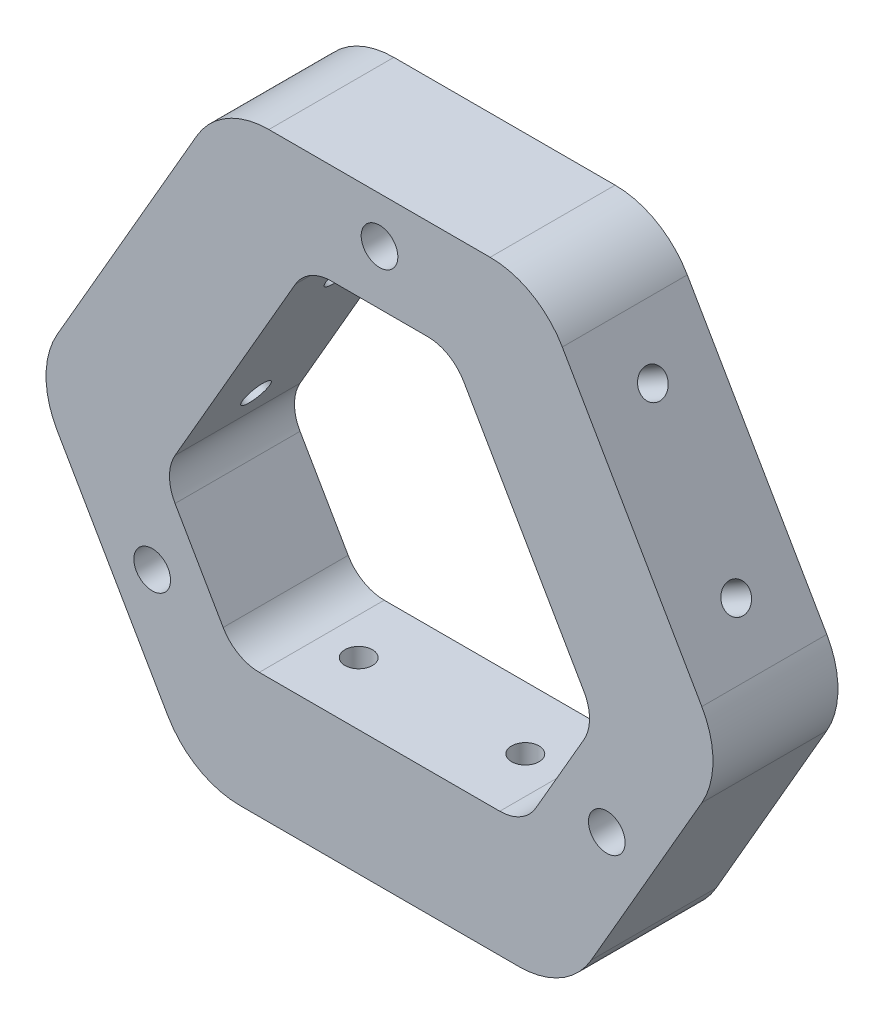
ISO-10303-21;
HEADER;
FILE_DESCRIPTION(('STEP AP214'),'2;1');
FILE_NAME('part.step','',(''),(''),'','','');
FILE_SCHEMA(('AUTOMOTIVE_DESIGN { 1 0 10303 214 1 1 1 1 }'));
ENDSEC;
DATA;
#1=APPLICATION_CONTEXT('core data for automotive mechanical design processes');
#2=APPLICATION_PROTOCOL_DEFINITION('international standard','automotive_design',2000,#1);
#3=PRODUCT_CONTEXT('',#1,'mechanical');
#4=PRODUCT('Part','Part','',(#3));
#5=PRODUCT_RELATED_PRODUCT_CATEGORY('part','',(#4));
#6=PRODUCT_DEFINITION_FORMATION('','',#4);
#7=PRODUCT_DEFINITION_CONTEXT('part definition',#1,'design');
#8=PRODUCT_DEFINITION('design','',#6,#7);
#9=PRODUCT_DEFINITION_SHAPE('','',#8);
#10=(LENGTH_UNIT() NAMED_UNIT(*) SI_UNIT(.MILLI.,.METRE.));
#11=(NAMED_UNIT(*) PLANE_ANGLE_UNIT() SI_UNIT($,.RADIAN.));
#12=(NAMED_UNIT(*) SI_UNIT($,.STERADIAN.) SOLID_ANGLE_UNIT());
#13=UNCERTAINTY_MEASURE_WITH_UNIT(LENGTH_MEASURE(1.E-05),#10,'distance_accuracy_value','');
#14=(GEOMETRIC_REPRESENTATION_CONTEXT(3) GLOBAL_UNCERTAINTY_ASSIGNED_CONTEXT((#13)) GLOBAL_UNIT_ASSIGNED_CONTEXT((#10,
#11,#12)) REPRESENTATION_CONTEXT('',''));
#15=CARTESIAN_POINT('',(0.,0.,0.));
#16=DIRECTION('',(0.,0.,1.));
#17=DIRECTION('',(1.,0.,0.));
#18=AXIS2_PLACEMENT_3D('',#15,#16,#17);
#19=CARTESIAN_POINT('',(0.,0.,15.));
#20=DIRECTION('',(0.,0.,1.));
#21=DIRECTION('',(1.,0.,0.));
#22=AXIS2_PLACEMENT_3D('',#19,#20,#21);
#23=PLANE('',#22);
#24=CARTESIAN_POINT('',(0.,31.5,15.));
#25=DIRECTION('',(0.,0.,1.));
#26=DIRECTION('',(1.,0.,0.));
#27=AXIS2_PLACEMENT_3D('',#24,#25,#26);
#28=CIRCLE('',#27,2.2);
#29=CARTESIAN_POINT('',(2.2,31.5,15.));
#30=VERTEX_POINT('',#29);
#31=EDGE_CURVE('E535',#30,#30,#28,.T.);
#32=ORIENTED_EDGE('',*,*,#31,.F.);
#33=EDGE_LOOP('',(#32));
#34=FACE_BOUND('',#33,.T.);
#35=CARTESIAN_POINT('',(27.2798002192098,-15.75,15.));
#36=DIRECTION('',(0.,0.,1.));
#37=DIRECTION('',(1.,0.,0.));
#38=AXIS2_PLACEMENT_3D('',#35,#36,#37);
#39=CIRCLE('',#38,2.2);
#40=CARTESIAN_POINT('',(29.4798002192098,-15.75,15.));
#41=VERTEX_POINT('',#40);
#42=EDGE_CURVE('E551',#41,#41,#39,.T.);
#43=ORIENTED_EDGE('',*,*,#42,.F.);
#44=EDGE_LOOP('',(#43));
#45=FACE_BOUND('',#44,.T.);
#46=CARTESIAN_POINT('',(-27.2798002192098,-15.75,15.));
#47=DIRECTION('',(0.,0.,1.));
#48=DIRECTION('',(1.,0.,0.));
#49=AXIS2_PLACEMENT_3D('',#46,#47,#48);
#50=CIRCLE('',#49,2.2);
#51=CARTESIAN_POINT('',(-25.0798002192098,-15.75,15.));
#52=VERTEX_POINT('',#51);
#53=EDGE_CURVE('E545',#52,#52,#50,.T.);
#54=ORIENTED_EDGE('',*,*,#53,.F.);
#55=EDGE_LOOP('',(#54));
#56=FACE_BOUND('',#55,.T.);
#57=DIRECTION('',(-0.5,0.866025403784439,0.));
#58=VECTOR('',#57,1.);
#59=CARTESIAN_POINT('',(60.6217782649107,-35.,15.));
#60=LINE('',#59,#58);
#61=CARTESIAN_POINT('',(38.6824680357049,3.00000000000001,15.));
#62=VERTEX_POINT('',#61);
#63=CARTESIAN_POINT('',(21.9393102292058,32.,15.));
#64=VERTEX_POINT('',#63);
#65=EDGE_CURVE('E216',#62,#64,#60,.T.);
#66=ORIENTED_EDGE('',*,*,#65,.T.);
#67=CARTESIAN_POINT('',(13.2790561913614,27.,15.));
#68=DIRECTION('',(0.,0.,1.));
#69=DIRECTION('',(1.,0.,0.));
#70=AXIS2_PLACEMENT_3D('',#67,#68,#69);
#71=CIRCLE('',#70,10.);
#72=CARTESIAN_POINT('',(13.2790561913614,37.,15.));
#73=VERTEX_POINT('',#72);
#74=EDGE_CURVE('E494',#64,#73,#71,.T.);
#75=ORIENTED_EDGE('',*,*,#74,.T.);
#76=DIRECTION('',(1.,0.,0.));
#77=VECTOR('',#76,1.);
#78=CARTESIAN_POINT('',(0.,37.,15.));
#79=LINE('',#78,#77);
#80=CARTESIAN_POINT('',(-13.2790561913614,37.,15.));
#81=VERTEX_POINT('',#80);
#82=EDGE_CURVE('E517',#81,#73,#79,.T.);
#83=ORIENTED_EDGE('',*,*,#82,.F.);
#84=CARTESIAN_POINT('',(-13.2790561913614,27.,15.));
#85=DIRECTION('',(0.,0.,1.));
#86=DIRECTION('',(1.,0.,0.));
#87=AXIS2_PLACEMENT_3D('',#84,#85,#86);
#88=CIRCLE('',#87,10.);
#89=CARTESIAN_POINT('',(-21.9393102292058,32.,15.));
#90=VERTEX_POINT('',#89);
#91=EDGE_CURVE('E484',#81,#90,#88,.T.);
#92=ORIENTED_EDGE('',*,*,#91,.T.);
#93=DIRECTION('',(-0.5,-0.866025403784439,0.));
#94=VECTOR('',#93,1.);
#95=CARTESIAN_POINT('',(0.,70.,15.));
#96=LINE('',#95,#94);
#97=CARTESIAN_POINT('',(-38.6824680357049,3.,15.));
#98=VERTEX_POINT('',#97);
#99=EDGE_CURVE('E461',#90,#98,#96,.T.);
#100=ORIENTED_EDGE('',*,*,#99,.T.);
#101=CARTESIAN_POINT('',(-30.0222139978605,-2.,15.));
#102=DIRECTION('',(0.,0.,1.));
#103=DIRECTION('',(1.,0.,0.));
#104=AXIS2_PLACEMENT_3D('',#101,#102,#103);
#105=CIRCLE('',#104,10.);
#106=CARTESIAN_POINT('',(-38.6824680357049,-7.00000000000001,15.));
#107=VERTEX_POINT('',#106);
#108=EDGE_CURVE('E486',#98,#107,#105,.T.);
#109=ORIENTED_EDGE('',*,*,#108,.T.);
#110=DIRECTION('',(-0.5,0.866025403784438,0.));
#111=VECTOR('',#110,1.);
#112=CARTESIAN_POINT('',(-32.0429399400242,-18.5,15.));
#113=LINE('',#112,#111);
#114=CARTESIAN_POINT('',(-25.4034118443435,-30.,15.));
#115=VERTEX_POINT('',#114);
#116=EDGE_CURVE('E518',#115,#107,#113,.T.);
#117=ORIENTED_EDGE('',*,*,#116,.F.);
#118=CARTESIAN_POINT('',(-16.7431578064992,-25.,15.));
#119=DIRECTION('',(0.,0.,1.));
#120=DIRECTION('',(1.,0.,0.));
#121=AXIS2_PLACEMENT_3D('',#118,#119,#120);
#122=CIRCLE('',#121,10.);
#123=CARTESIAN_POINT('',(-16.7431578064992,-35.,15.));
#124=VERTEX_POINT('',#123);
#125=EDGE_CURVE('E488',#115,#124,#122,.T.);
#126=ORIENTED_EDGE('',*,*,#125,.T.);
#127=DIRECTION('',(1.,0.,0.));
#128=VECTOR('',#127,1.);
#129=CARTESIAN_POINT('',(-60.6217782649107,-35.,15.));
#130=LINE('',#129,#128);
#131=CARTESIAN_POINT('',(16.7431578064991,-35.,15.));
#132=VERTEX_POINT('',#131);
#133=EDGE_CURVE('E220',#124,#132,#130,.T.);
#134=ORIENTED_EDGE('',*,*,#133,.T.);
#135=CARTESIAN_POINT('',(16.7431578064992,-25.,15.));
#136=DIRECTION('',(0.,0.,1.));
#137=DIRECTION('',(1.,0.,0.));
#138=AXIS2_PLACEMENT_3D('',#135,#136,#137);
#139=CIRCLE('',#138,10.);
#140=CARTESIAN_POINT('',(25.4034118443435,-30.,15.));
#141=VERTEX_POINT('',#140);
#142=EDGE_CURVE('E490',#132,#141,#139,.T.);
#143=ORIENTED_EDGE('',*,*,#142,.T.);
#144=DIRECTION('',(-0.5,-0.866025403784439,0.));
#145=VECTOR('',#144,1.);
#146=CARTESIAN_POINT('',(32.0429399400242,-18.5,15.));
#147=LINE('',#146,#145);
#148=CARTESIAN_POINT('',(38.6824680357049,-7.,15.));
#149=VERTEX_POINT('',#148);
#150=EDGE_CURVE('E528',#149,#141,#147,.T.);
#151=ORIENTED_EDGE('',*,*,#150,.F.);
#152=CARTESIAN_POINT('',(30.0222139978605,-2.,15.));
#153=DIRECTION('',(0.,0.,1.));
#154=DIRECTION('',(1.,0.,0.));
#155=AXIS2_PLACEMENT_3D('',#152,#153,#154);
#156=CIRCLE('',#155,10.);
#157=EDGE_CURVE('E492',#149,#62,#156,.T.);
#158=ORIENTED_EDGE('',*,*,#157,.T.);
#159=EDGE_LOOP('',(#66,#75,#83,#92,#100,#109,#117,#126,#134,#143,#151,#158));
#160=FACE_BOUND('',#159,.T.);
#161=DIRECTION('',(-0.5,0.866025403784439,0.));
#162=VECTOR('',#161,1.);
#163=CARTESIAN_POINT('',(34.6410161513775,-20.,15.));
#164=LINE('',#163,#162);
#165=CARTESIAN_POINT('',(24.5373864405591,-2.50000000000001,15.));
#166=VERTEX_POINT('',#165);
#167=CARTESIAN_POINT('',(10.1036297108184,22.5,15.));
#168=VERTEX_POINT('',#167);
#169=EDGE_CURVE('E446',#166,#168,#164,.T.);
#170=ORIENTED_EDGE('',*,*,#169,.F.);
#171=CARTESIAN_POINT('',(20.2072594216369,-5.,15.));
#172=DIRECTION('',(0.,0.,1.));
#173=DIRECTION('',(1.,0.,0.));
#174=AXIS2_PLACEMENT_3D('',#171,#172,#173);
#175=CIRCLE('',#174,5.);
#176=CARTESIAN_POINT('',(24.5373864405591,-7.5,15.));
#177=VERTEX_POINT('',#176);
#178=EDGE_CURVE('E303',#166,#177,#175,.F.);
#179=ORIENTED_EDGE('',*,*,#178,.T.);
#180=DIRECTION('',(-0.5,-0.866025403784439,0.));
#181=VECTOR('',#180,1.);
#182=CARTESIAN_POINT('',(21.650635094611,-12.5,15.));
#183=LINE('',#182,#181);
#184=CARTESIAN_POINT('',(18.7638837486628,-17.5,15.));
#185=VERTEX_POINT('',#184);
#186=EDGE_CURVE('E412',#177,#185,#183,.T.);
#187=ORIENTED_EDGE('',*,*,#186,.T.);
#188=CARTESIAN_POINT('',(14.4337567297407,-15.,15.));
#189=DIRECTION('',(0.,0.,1.));
#190=DIRECTION('',(1.,0.,0.));
#191=AXIS2_PLACEMENT_3D('',#188,#189,#190);
#192=CIRCLE('',#191,5.);
#193=CARTESIAN_POINT('',(14.4337567297407,-20.,15.));
#194=VERTEX_POINT('',#193);
#195=EDGE_CURVE('E299',#185,#194,#192,.F.);
#196=ORIENTED_EDGE('',*,*,#195,.T.);
#197=DIRECTION('',(1.,0.,0.));
#198=VECTOR('',#197,1.);
#199=CARTESIAN_POINT('',(-34.6410161513775,-20.,15.));
#200=LINE('',#199,#198);
#201=CARTESIAN_POINT('',(-14.4337567297406,-20.,15.));
#202=VERTEX_POINT('',#201);
#203=EDGE_CURVE('E231',#202,#194,#200,.T.);
#204=ORIENTED_EDGE('',*,*,#203,.F.);
#205=CARTESIAN_POINT('',(-14.4337567297406,-15.,15.));
#206=DIRECTION('',(0.,0.,1.));
#207=DIRECTION('',(1.,0.,0.));
#208=AXIS2_PLACEMENT_3D('',#205,#206,#207);
#209=CIRCLE('',#208,5.);
#210=CARTESIAN_POINT('',(-18.7638837486628,-17.5,15.));
#211=VERTEX_POINT('',#210);
#212=EDGE_CURVE('E295',#202,#211,#209,.F.);
#213=ORIENTED_EDGE('',*,*,#212,.T.);
#214=DIRECTION('',(-0.500000000000001,0.866025403784438,0.));
#215=VECTOR('',#214,1.);
#216=CARTESIAN_POINT('',(-21.650635094611,-12.5,15.));
#217=LINE('',#216,#215);
#218=CARTESIAN_POINT('',(-24.5373864405591,-7.50000000000001,15.));
#219=VERTEX_POINT('',#218);
#220=EDGE_CURVE('E411',#211,#219,#217,.T.);
#221=ORIENTED_EDGE('',*,*,#220,.T.);
#222=CARTESIAN_POINT('',(-20.2072594216369,-5.00000000000001,15.));
#223=DIRECTION('',(0.,0.,1.));
#224=DIRECTION('',(1.,0.,0.));
#225=AXIS2_PLACEMENT_3D('',#222,#223,#224);
#226=CIRCLE('',#225,5.);
#227=CARTESIAN_POINT('',(-24.5373864405591,-2.50000000000001,15.));
#228=VERTEX_POINT('',#227);
#229=EDGE_CURVE('E291',#219,#228,#226,.F.);
#230=ORIENTED_EDGE('',*,*,#229,.T.);
#231=DIRECTION('',(-0.5,-0.866025403784439,0.));
#232=VECTOR('',#231,1.);
#233=CARTESIAN_POINT('',(0.,40.,15.));
#234=LINE('',#233,#232);
#235=CARTESIAN_POINT('',(-10.1036297108184,22.5,15.));
#236=VERTEX_POINT('',#235);
#237=EDGE_CURVE('E449',#236,#228,#234,.T.);
#238=ORIENTED_EDGE('',*,*,#237,.F.);
#239=CARTESIAN_POINT('',(-5.77350269189625,20.,15.));
#240=DIRECTION('',(0.,0.,1.));
#241=DIRECTION('',(1.,0.,0.));
#242=AXIS2_PLACEMENT_3D('',#239,#240,#241);
#243=CIRCLE('',#242,5.);
#244=CARTESIAN_POINT('',(-5.77350269189625,25.,15.));
#245=VERTEX_POINT('',#244);
#246=EDGE_CURVE('E55',#236,#245,#243,.F.);
#247=ORIENTED_EDGE('',*,*,#246,.T.);
#248=DIRECTION('',(1.,0.,0.));
#249=VECTOR('',#248,1.);
#250=CARTESIAN_POINT('',(0.,25.,15.));
#251=LINE('',#250,#249);
#252=CARTESIAN_POINT('',(5.77350269189626,25.,15.));
#253=VERTEX_POINT('',#252);
#254=EDGE_CURVE('E323',#245,#253,#251,.T.);
#255=ORIENTED_EDGE('',*,*,#254,.T.);
#256=CARTESIAN_POINT('',(5.77350269189626,20.,15.));
#257=DIRECTION('',(0.,0.,1.));
#258=DIRECTION('',(1.,0.,0.));
#259=AXIS2_PLACEMENT_3D('',#256,#257,#258);
#260=CIRCLE('',#259,5.);
#261=EDGE_CURVE('E62',#253,#168,#260,.F.);
#262=ORIENTED_EDGE('',*,*,#261,.T.);
#263=EDGE_LOOP('',(#170,#179,#187,#196,#204,#213,#221,#230,#238,#247,#255,#262));
#264=FACE_BOUND('',#263,.T.);
#265=ADVANCED_FACE('F47',(#34,#45,#56,#160,#264),#23,.T.);
#266=CARTESIAN_POINT('',(0.,0.,0.));
#267=DIRECTION('',(0.,0.,1.));
#268=DIRECTION('',(1.,0.,0.));
#269=AXIS2_PLACEMENT_3D('',#266,#267,#268);
#270=PLANE('',#269);
#271=CARTESIAN_POINT('',(0.,31.5,0.));
#272=DIRECTION('',(0.,0.,1.));
#273=DIRECTION('',(1.,0.,0.));
#274=AXIS2_PLACEMENT_3D('',#271,#272,#273);
#275=CIRCLE('',#274,2.2);
#276=CARTESIAN_POINT('',(2.2,31.5,0.));
#277=VERTEX_POINT('',#276);
#278=EDGE_CURVE('E532',#277,#277,#275,.T.);
#279=ORIENTED_EDGE('',*,*,#278,.T.);
#280=EDGE_LOOP('',(#279));
#281=FACE_BOUND('',#280,.T.);
#282=CARTESIAN_POINT('',(27.2798002192098,-15.75,0.));
#283=DIRECTION('',(0.,0.,1.));
#284=DIRECTION('',(1.,0.,0.));
#285=AXIS2_PLACEMENT_3D('',#282,#283,#284);
#286=CIRCLE('',#285,2.2);
#287=CARTESIAN_POINT('',(29.4798002192098,-15.75,0.));
#288=VERTEX_POINT('',#287);
#289=EDGE_CURVE('E548',#288,#288,#286,.T.);
#290=ORIENTED_EDGE('',*,*,#289,.T.);
#291=EDGE_LOOP('',(#290));
#292=FACE_BOUND('',#291,.T.);
#293=CARTESIAN_POINT('',(-27.2798002192098,-15.75,0.));
#294=DIRECTION('',(0.,0.,1.));
#295=DIRECTION('',(1.,0.,0.));
#296=AXIS2_PLACEMENT_3D('',#293,#294,#295);
#297=CIRCLE('',#296,2.2);
#298=CARTESIAN_POINT('',(-25.0798002192098,-15.75,0.));
#299=VERTEX_POINT('',#298);
#300=EDGE_CURVE('E542',#299,#299,#297,.T.);
#301=ORIENTED_EDGE('',*,*,#300,.T.);
#302=EDGE_LOOP('',(#301));
#303=FACE_BOUND('',#302,.T.);
#304=DIRECTION('',(1.,0.,0.));
#305=VECTOR('',#304,1.);
#306=CARTESIAN_POINT('',(-34.6410161513775,-20.,0.));
#307=LINE('',#306,#305);
#308=CARTESIAN_POINT('',(-14.4337567297406,-20.,0.));
#309=VERTEX_POINT('',#308);
#310=CARTESIAN_POINT('',(14.4337567297407,-20.,0.));
#311=VERTEX_POINT('',#310);
#312=EDGE_CURVE('E405',#309,#311,#307,.T.);
#313=ORIENTED_EDGE('',*,*,#312,.T.);
#314=CARTESIAN_POINT('',(14.4337567297407,-15.,0.));
#315=DIRECTION('',(0.,0.,1.));
#316=DIRECTION('',(1.,0.,0.));
#317=AXIS2_PLACEMENT_3D('',#314,#315,#316);
#318=CIRCLE('',#317,5.);
#319=CARTESIAN_POINT('',(18.7638837486628,-17.5,0.));
#320=VERTEX_POINT('',#319);
#321=EDGE_CURVE('E301',#311,#320,#318,.T.);
#322=ORIENTED_EDGE('',*,*,#321,.T.);
#323=DIRECTION('',(0.5,0.866025403784439,0.));
#324=VECTOR('',#323,1.);
#325=CARTESIAN_POINT('',(21.650635094611,-12.5,0.));
#326=LINE('',#325,#324);
#327=CARTESIAN_POINT('',(24.5373864405591,-7.5,0.));
#328=VERTEX_POINT('',#327);
#329=EDGE_CURVE('E402',#320,#328,#326,.T.);
#330=ORIENTED_EDGE('',*,*,#329,.T.);
#331=CARTESIAN_POINT('',(20.2072594216369,-5.,0.));
#332=DIRECTION('',(0.,0.,1.));
#333=DIRECTION('',(1.,0.,0.));
#334=AXIS2_PLACEMENT_3D('',#331,#332,#333);
#335=CIRCLE('',#334,5.);
#336=CARTESIAN_POINT('',(24.5373864405591,-2.50000000000001,0.));
#337=VERTEX_POINT('',#336);
#338=EDGE_CURVE('E305',#328,#337,#335,.T.);
#339=ORIENTED_EDGE('',*,*,#338,.T.);
#340=DIRECTION('',(-0.5,0.866025403784439,0.));
#341=VECTOR('',#340,1.);
#342=CARTESIAN_POINT('',(34.6410161513775,-20.,0.));
#343=LINE('',#342,#341);
#344=CARTESIAN_POINT('',(10.1036297108184,22.5,0.));
#345=VERTEX_POINT('',#344);
#346=EDGE_CURVE('E318',#337,#345,#343,.T.);
#347=ORIENTED_EDGE('',*,*,#346,.T.);
#348=CARTESIAN_POINT('',(5.77350269189626,20.,0.));
#349=DIRECTION('',(0.,0.,1.));
#350=DIRECTION('',(1.,0.,0.));
#351=AXIS2_PLACEMENT_3D('',#348,#349,#350);
#352=CIRCLE('',#351,5.);
#353=CARTESIAN_POINT('',(5.77350269189626,25.,0.));
#354=VERTEX_POINT('',#353);
#355=EDGE_CURVE('E308',#345,#354,#352,.T.);
#356=ORIENTED_EDGE('',*,*,#355,.T.);
#357=DIRECTION('',(-1.,0.,0.));
#358=VECTOR('',#357,1.);
#359=CARTESIAN_POINT('',(0.,25.,0.));
#360=LINE('',#359,#358);
#361=CARTESIAN_POINT('',(-5.77350269189625,25.,0.));
#362=VERTEX_POINT('',#361);
#363=EDGE_CURVE('E315',#354,#362,#360,.T.);
#364=ORIENTED_EDGE('',*,*,#363,.T.);
#365=CARTESIAN_POINT('',(-5.77350269189625,20.,0.));
#366=DIRECTION('',(0.,0.,1.));
#367=DIRECTION('',(1.,0.,0.));
#368=AXIS2_PLACEMENT_3D('',#365,#366,#367);
#369=CIRCLE('',#368,5.);
#370=CARTESIAN_POINT('',(-10.1036297108184,22.5,0.));
#371=VERTEX_POINT('',#370);
#372=EDGE_CURVE('E11',#362,#371,#369,.T.);
#373=ORIENTED_EDGE('',*,*,#372,.T.);
#374=DIRECTION('',(-0.5,-0.866025403784439,0.));
#375=VECTOR('',#374,1.);
#376=CARTESIAN_POINT('',(0.,40.,0.));
#377=LINE('',#376,#375);
#378=CARTESIAN_POINT('',(-24.5373864405591,-2.50000000000001,0.));
#379=VERTEX_POINT('',#378);
#380=EDGE_CURVE('E455',#371,#379,#377,.T.);
#381=ORIENTED_EDGE('',*,*,#380,.T.);
#382=CARTESIAN_POINT('',(-20.2072594216369,-5.00000000000001,0.));
#383=DIRECTION('',(0.,0.,1.));
#384=DIRECTION('',(1.,0.,0.));
#385=AXIS2_PLACEMENT_3D('',#382,#383,#384);
#386=CIRCLE('',#385,5.);
#387=CARTESIAN_POINT('',(-24.5373864405591,-7.50000000000001,0.));
#388=VERTEX_POINT('',#387);
#389=EDGE_CURVE('E293',#379,#388,#386,.T.);
#390=ORIENTED_EDGE('',*,*,#389,.T.);
#391=DIRECTION('',(0.500000000000001,-0.866025403784438,0.));
#392=VECTOR('',#391,1.);
#393=CARTESIAN_POINT('',(-21.650635094611,-12.5,0.));
#394=LINE('',#393,#392);
#395=CARTESIAN_POINT('',(-18.7638837486628,-17.5,0.));
#396=VERTEX_POINT('',#395);
#397=EDGE_CURVE('E415',#388,#396,#394,.T.);
#398=ORIENTED_EDGE('',*,*,#397,.T.);
#399=CARTESIAN_POINT('',(-14.4337567297406,-15.,0.));
#400=DIRECTION('',(0.,0.,1.));
#401=DIRECTION('',(1.,0.,0.));
#402=AXIS2_PLACEMENT_3D('',#399,#400,#401);
#403=CIRCLE('',#402,5.);
#404=EDGE_CURVE('E297',#396,#309,#403,.T.);
#405=ORIENTED_EDGE('',*,*,#404,.T.);
#406=EDGE_LOOP('',(#313,#322,#330,#339,#347,#356,#364,#373,#381,#390,#398,#405));
#407=FACE_BOUND('',#406,.T.);
#408=DIRECTION('',(1.,0.,0.));
#409=VECTOR('',#408,1.);
#410=CARTESIAN_POINT('',(0.,37.,0.));
#411=LINE('',#410,#409);
#412=CARTESIAN_POINT('',(-13.2790561913614,37.,0.));
#413=VERTEX_POINT('',#412);
#414=CARTESIAN_POINT('',(13.2790561913614,37.,0.));
#415=VERTEX_POINT('',#414);
#416=EDGE_CURVE('E417',#413,#415,#411,.T.);
#417=ORIENTED_EDGE('',*,*,#416,.T.);
#418=CARTESIAN_POINT('',(13.2790561913614,27.,0.));
#419=DIRECTION('',(0.,0.,1.));
#420=DIRECTION('',(1.,0.,0.));
#421=AXIS2_PLACEMENT_3D('',#418,#419,#420);
#422=CIRCLE('',#421,10.);
#423=CARTESIAN_POINT('',(21.9393102292058,32.,0.));
#424=VERTEX_POINT('',#423);
#425=EDGE_CURVE('E229',#415,#424,#422,.F.);
#426=ORIENTED_EDGE('',*,*,#425,.T.);
#427=DIRECTION('',(-0.5,0.866025403784439,0.));
#428=VECTOR('',#427,1.);
#429=CARTESIAN_POINT('',(60.6217782649107,-35.,0.));
#430=LINE('',#429,#428);
#431=CARTESIAN_POINT('',(38.6824680357049,3.00000000000001,0.));
#432=VERTEX_POINT('',#431);
#433=EDGE_CURVE('E213',#432,#424,#430,.T.);
#434=ORIENTED_EDGE('',*,*,#433,.F.);
#435=CARTESIAN_POINT('',(30.0222139978605,-2.,0.));
#436=DIRECTION('',(0.,0.,1.));
#437=DIRECTION('',(1.,0.,0.));
#438=AXIS2_PLACEMENT_3D('',#435,#436,#437);
#439=CIRCLE('',#438,10.);
#440=CARTESIAN_POINT('',(38.6824680357049,-7.,0.));
#441=VERTEX_POINT('',#440);
#442=EDGE_CURVE('E226',#432,#441,#439,.F.);
#443=ORIENTED_EDGE('',*,*,#442,.T.);
#444=DIRECTION('',(-0.5,-0.866025403784439,0.));
#445=VECTOR('',#444,1.);
#446=CARTESIAN_POINT('',(32.0429399400242,-18.5,0.));
#447=LINE('',#446,#445);
#448=CARTESIAN_POINT('',(25.4034118443435,-30.,0.));
#449=VERTEX_POINT('',#448);
#450=EDGE_CURVE('E531',#441,#449,#447,.T.);
#451=ORIENTED_EDGE('',*,*,#450,.T.);
#452=CARTESIAN_POINT('',(16.7431578064992,-25.,0.));
#453=DIRECTION('',(0.,0.,1.));
#454=DIRECTION('',(1.,0.,0.));
#455=AXIS2_PLACEMENT_3D('',#452,#453,#454);
#456=CIRCLE('',#455,10.);
#457=CARTESIAN_POINT('',(16.7431578064991,-35.,0.));
#458=VERTEX_POINT('',#457);
#459=EDGE_CURVE('E237',#449,#458,#456,.F.);
#460=ORIENTED_EDGE('',*,*,#459,.T.);
#461=DIRECTION('',(1.,0.,0.));
#462=VECTOR('',#461,1.);
#463=CARTESIAN_POINT('',(-60.6217782649107,-35.,0.));
#464=LINE('',#463,#462);
#465=CARTESIAN_POINT('',(-16.7431578064992,-35.,0.));
#466=VERTEX_POINT('',#465);
#467=EDGE_CURVE('E462',#466,#458,#464,.T.);
#468=ORIENTED_EDGE('',*,*,#467,.F.);
#469=CARTESIAN_POINT('',(-16.7431578064992,-25.,0.));
#470=DIRECTION('',(0.,0.,1.));
#471=DIRECTION('',(1.,0.,0.));
#472=AXIS2_PLACEMENT_3D('',#469,#470,#471);
#473=CIRCLE('',#472,10.);
#474=CARTESIAN_POINT('',(-25.4034118443435,-30.,0.));
#475=VERTEX_POINT('',#474);
#476=EDGE_CURVE('E241',#466,#475,#473,.F.);
#477=ORIENTED_EDGE('',*,*,#476,.T.);
#478=DIRECTION('',(-0.5,0.866025403784438,0.));
#479=VECTOR('',#478,1.);
#480=CARTESIAN_POINT('',(-32.0429399400242,-18.5,0.));
#481=LINE('',#480,#479);
#482=CARTESIAN_POINT('',(-38.6824680357049,-7.00000000000001,0.));
#483=VERTEX_POINT('',#482);
#484=EDGE_CURVE('E508',#475,#483,#481,.T.);
#485=ORIENTED_EDGE('',*,*,#484,.T.);
#486=CARTESIAN_POINT('',(-30.0222139978605,-2.,0.));
#487=DIRECTION('',(0.,0.,1.));
#488=DIRECTION('',(1.,0.,0.));
#489=AXIS2_PLACEMENT_3D('',#486,#487,#488);
#490=CIRCLE('',#489,10.);
#491=CARTESIAN_POINT('',(-38.6824680357049,3.,0.));
#492=VERTEX_POINT('',#491);
#493=EDGE_CURVE('E503',#483,#492,#490,.F.);
#494=ORIENTED_EDGE('',*,*,#493,.T.);
#495=DIRECTION('',(-0.5,-0.866025403784439,0.));
#496=VECTOR('',#495,1.);
#497=CARTESIAN_POINT('',(0.,70.,0.));
#498=LINE('',#497,#496);
#499=CARTESIAN_POINT('',(-21.9393102292058,32.,0.));
#500=VERTEX_POINT('',#499);
#501=EDGE_CURVE('E230',#500,#492,#498,.T.);
#502=ORIENTED_EDGE('',*,*,#501,.F.);
#503=CARTESIAN_POINT('',(-13.2790561913614,27.,0.));
#504=DIRECTION('',(0.,0.,1.));
#505=DIRECTION('',(1.,0.,0.));
#506=AXIS2_PLACEMENT_3D('',#503,#504,#505);
#507=CIRCLE('',#506,10.);
#508=EDGE_CURVE('E501',#500,#413,#507,.F.);
#509=ORIENTED_EDGE('',*,*,#508,.T.);
#510=EDGE_LOOP('',(#417,#426,#434,#443,#451,#460,#468,#477,#485,#494,#502,#509));
#511=FACE_BOUND('',#510,.T.);
#512=ADVANCED_FACE('F224',(#281,#292,#303,#407,#511),#270,.F.);
#513=CARTESIAN_POINT('',(60.6217782649107,-35.,15.));
#514=DIRECTION('',(-0.866025403784439,-0.5,0.));
#515=DIRECTION('',(0.5,-0.866025403784439,0.));
#516=AXIS2_PLACEMENT_3D('',#513,#514,#515);
#517=PLANE('',#516);
#518=CARTESIAN_POINT('',(25.3108891324553,26.1602540378444,7.5));
#519=DIRECTION('',(0.866025403784439,0.5,0.));
#520=DIRECTION('',(-0.5,0.866025403784438,0.));
#521=AXIS2_PLACEMENT_3D('',#518,#519,#520);
#522=CIRCLE('',#521,1.65);
#523=CARTESIAN_POINT('',(24.4858891324553,27.5891959540887,7.5));
#524=VERTEX_POINT('',#523);
#525=EDGE_CURVE('E430',#524,#524,#522,.T.);
#526=ORIENTED_EDGE('',*,*,#525,.F.);
#527=EDGE_LOOP('',(#526));
#528=FACE_BOUND('',#527,.T.);
#529=CARTESIAN_POINT('',(35.3108891324554,8.83974596215562,7.5));
#530=DIRECTION('',(0.866025403784439,0.5,0.));
#531=DIRECTION('',(0.5,-0.866025403784438,0.));
#532=AXIS2_PLACEMENT_3D('',#529,#530,#531);
#533=CIRCLE('',#532,1.65);
#534=CARTESIAN_POINT('',(36.1358891324553,7.4108040459113,7.5));
#535=VERTEX_POINT('',#534);
#536=EDGE_CURVE('E434',#535,#535,#533,.T.);
#537=ORIENTED_EDGE('',*,*,#536,.F.);
#538=EDGE_LOOP('',(#537));
#539=FACE_BOUND('',#538,.T.);
#540=ORIENTED_EDGE('',*,*,#433,.T.);
#541=DIRECTION('',(0.,0.,1.));
#542=VECTOR('',#541,1.);
#543=CARTESIAN_POINT('',(21.9393102292058,32.,15.));
#544=LINE('',#543,#542);
#545=EDGE_CURVE('E219',#424,#64,#544,.T.);
#546=ORIENTED_EDGE('',*,*,#545,.T.);
#547=ORIENTED_EDGE('',*,*,#65,.F.);
#548=DIRECTION('',(0.,0.,1.));
#549=VECTOR('',#548,1.);
#550=CARTESIAN_POINT('',(38.6824680357049,3.00000000000001,15.));
#551=LINE('',#550,#549);
#552=EDGE_CURVE('E209',#62,#432,#551,.F.);
#553=ORIENTED_EDGE('',*,*,#552,.T.);
#554=EDGE_LOOP('',(#540,#546,#547,#553));
#555=FACE_BOUND('',#554,.T.);
#556=ADVANCED_FACE('F211',(#528,#539,#555),#517,.F.);
#557=CARTESIAN_POINT('',(0.,70.,15.));
#558=DIRECTION('',(0.866025403784439,-0.5,0.));
#559=DIRECTION('',(0.5,0.866025403784439,0.));
#560=AXIS2_PLACEMENT_3D('',#557,#558,#559);
#561=PLANE('',#560);
#562=CARTESIAN_POINT('',(-25.3108891324553,26.1602540378444,7.49999999999998));
#563=DIRECTION('',(-0.866025403784439,0.5,0.));
#564=DIRECTION('',(-0.5,-0.866025403784438,0.));
#565=AXIS2_PLACEMENT_3D('',#562,#563,#564);
#566=CIRCLE('',#565,1.65);
#567=CARTESIAN_POINT('',(-26.1358891324553,24.7313121216001,7.49999999999998));
#568=VERTEX_POINT('',#567);
#569=EDGE_CURVE('E424',#568,#568,#566,.T.);
#570=ORIENTED_EDGE('',*,*,#569,.F.);
#571=EDGE_LOOP('',(#570));
#572=FACE_BOUND('',#571,.T.);
#573=CARTESIAN_POINT('',(-35.3108891324554,8.83974596215562,7.49999999999998));
#574=DIRECTION('',(-0.866025403784439,0.5,0.));
#575=DIRECTION('',(0.5,0.866025403784438,0.));
#576=AXIS2_PLACEMENT_3D('',#573,#574,#575);
#577=CIRCLE('',#576,1.65);
#578=CARTESIAN_POINT('',(-34.4858891324553,10.2686878783999,7.49999999999998));
#579=VERTEX_POINT('',#578);
#580=EDGE_CURVE('E322',#579,#579,#577,.T.);
#581=ORIENTED_EDGE('',*,*,#580,.F.);
#582=EDGE_LOOP('',(#581));
#583=FACE_BOUND('',#582,.T.);
#584=ORIENTED_EDGE('',*,*,#501,.T.);
#585=DIRECTION('',(0.,0.,1.));
#586=VECTOR('',#585,1.);
#587=CARTESIAN_POINT('',(-38.6824680357049,3.,15.));
#588=LINE('',#587,#586);
#589=EDGE_CURVE('E259',#492,#98,#588,.T.);
#590=ORIENTED_EDGE('',*,*,#589,.T.);
#591=ORIENTED_EDGE('',*,*,#99,.F.);
#592=DIRECTION('',(0.,0.,1.));
#593=VECTOR('',#592,1.);
#594=CARTESIAN_POINT('',(-21.9393102292058,32.,15.));
#595=LINE('',#594,#593);
#596=EDGE_CURVE('E257',#90,#500,#595,.F.);
#597=ORIENTED_EDGE('',*,*,#596,.T.);
#598=EDGE_LOOP('',(#584,#590,#591,#597));
#599=FACE_BOUND('',#598,.T.);
#600=ADVANCED_FACE('F354',(#572,#583,#599),#561,.F.);
#601=CARTESIAN_POINT('',(-60.6217782649107,-35.,15.));
#602=DIRECTION('',(0.,1.,0.));
#603=DIRECTION('',(-1.,0.,0.));
#604=AXIS2_PLACEMENT_3D('',#601,#602,#603);
#605=PLANE('',#604);
#606=CARTESIAN_POINT('',(-10.,-35.,7.5));
#607=DIRECTION('',(0.,-1.,0.));
#608=DIRECTION('',(1.,0.,0.));
#609=AXIS2_PLACEMENT_3D('',#606,#607,#608);
#610=CIRCLE('',#609,1.65);
#611=CARTESIAN_POINT('',(-8.35,-35.,7.5));
#612=VERTEX_POINT('',#611);
#613=EDGE_CURVE('E438',#612,#612,#610,.T.);
#614=ORIENTED_EDGE('',*,*,#613,.F.);
#615=EDGE_LOOP('',(#614));
#616=FACE_BOUND('',#615,.T.);
#617=CARTESIAN_POINT('',(10.,-35.,7.5));
#618=DIRECTION('',(0.,-1.,0.));
#619=DIRECTION('',(-1.,0.,0.));
#620=AXIS2_PLACEMENT_3D('',#617,#618,#619);
#621=CIRCLE('',#620,1.65);
#622=CARTESIAN_POINT('',(8.35,-35.,7.5));
#623=VERTEX_POINT('',#622);
#624=EDGE_CURVE('E442',#623,#623,#621,.T.);
#625=ORIENTED_EDGE('',*,*,#624,.F.);
#626=EDGE_LOOP('',(#625));
#627=FACE_BOUND('',#626,.T.);
#628=ORIENTED_EDGE('',*,*,#467,.T.);
#629=DIRECTION('',(0.,0.,1.));
#630=VECTOR('',#629,1.);
#631=CARTESIAN_POINT('',(16.7431578064992,-35.,15.));
#632=LINE('',#631,#630);
#633=EDGE_CURVE('E249',#458,#132,#632,.T.);
#634=ORIENTED_EDGE('',*,*,#633,.T.);
#635=ORIENTED_EDGE('',*,*,#133,.F.);
#636=DIRECTION('',(0.,0.,1.));
#637=VECTOR('',#636,1.);
#638=CARTESIAN_POINT('',(-16.7431578064992,-35.,15.));
#639=LINE('',#638,#637);
#640=EDGE_CURVE('E247',#124,#466,#639,.F.);
#641=ORIENTED_EDGE('',*,*,#640,.T.);
#642=EDGE_LOOP('',(#628,#634,#635,#641));
#643=FACE_BOUND('',#642,.T.);
#644=ADVANCED_FACE('F351',(#616,#627,#643),#605,.F.);
#645=CARTESIAN_POINT('',(34.6410161513775,-20.,15.));
#646=DIRECTION('',(-0.866025403784439,-0.5,0.));
#647=DIRECTION('',(0.5,-0.866025403784439,0.));
#648=AXIS2_PLACEMENT_3D('',#645,#646,#647);
#649=PLANE('',#648);
#650=ORIENTED_EDGE('',*,*,#346,.F.);
#651=DIRECTION('',(0.,0.,1.));
#652=VECTOR('',#651,1.);
#653=CARTESIAN_POINT('',(24.5373864405591,-2.5,15.));
#654=LINE('',#653,#652);
#655=EDGE_CURVE('E284',#337,#166,#654,.T.);
#656=ORIENTED_EDGE('',*,*,#655,.T.);
#657=ORIENTED_EDGE('',*,*,#169,.T.);
#658=DIRECTION('',(0.,0.,1.));
#659=VECTOR('',#658,1.);
#660=CARTESIAN_POINT('',(10.1036297108184,22.5,0.));
#661=LINE('',#660,#659);
#662=EDGE_CURVE('E282',#168,#345,#661,.F.);
#663=ORIENTED_EDGE('',*,*,#662,.T.);
#664=EDGE_LOOP('',(#650,#656,#657,#663));
#665=FACE_BOUND('',#664,.T.);
#666=CARTESIAN_POINT('',(12.3205080756888,18.6602540378444,7.5));
#667=DIRECTION('',(-0.866025403784439,-0.5,0.));
#668=DIRECTION('',(0.5,-0.866025403784439,0.));
#669=AXIS2_PLACEMENT_3D('',#666,#667,#668);
#670=CIRCLE('',#669,1.65);
#671=CARTESIAN_POINT('',(13.1455080756888,17.2313121216001,7.5));
#672=VERTEX_POINT('',#671);
#673=EDGE_CURVE('E445',#672,#672,#670,.T.);
#674=ORIENTED_EDGE('',*,*,#673,.F.);
#675=EDGE_LOOP('',(#674));
#676=FACE_BOUND('',#675,.T.);
#677=CARTESIAN_POINT('',(22.3205080756888,1.33974596215562,7.5));
#678=DIRECTION('',(-0.866025403784439,-0.5,0.));
#679=DIRECTION('',(0.5,-0.866025403784439,0.));
#680=AXIS2_PLACEMENT_3D('',#677,#678,#679);
#681=CIRCLE('',#680,1.65);
#682=CARTESIAN_POINT('',(23.1455080756888,-0.0891959540887065,7.5));
#683=VERTEX_POINT('',#682);
#684=EDGE_CURVE('E433',#683,#683,#681,.T.);
#685=ORIENTED_EDGE('',*,*,#684,.F.);
#686=EDGE_LOOP('',(#685));
#687=FACE_BOUND('',#686,.T.);
#688=ADVANCED_FACE('F348',(#665,#676,#687),#649,.T.);
#689=CARTESIAN_POINT('',(0.,40.,15.));
#690=DIRECTION('',(0.866025403784439,-0.5,0.));
#691=DIRECTION('',(0.5,0.866025403784439,0.));
#692=AXIS2_PLACEMENT_3D('',#689,#690,#691);
#693=PLANE('',#692);
#694=ORIENTED_EDGE('',*,*,#237,.T.);
#695=DIRECTION('',(0.,0.,1.));
#696=VECTOR('',#695,1.);
#697=CARTESIAN_POINT('',(-24.5373864405591,-2.50000000000001,0.));
#698=LINE('',#697,#696);
#699=EDGE_CURVE('E270',#228,#379,#698,.F.);
#700=ORIENTED_EDGE('',*,*,#699,.T.);
#701=ORIENTED_EDGE('',*,*,#380,.F.);
#702=DIRECTION('',(0.,0.,1.));
#703=VECTOR('',#702,1.);
#704=CARTESIAN_POINT('',(-10.1036297108184,22.5,15.));
#705=LINE('',#704,#703);
#706=EDGE_CURVE('E267',#371,#236,#705,.T.);
#707=ORIENTED_EDGE('',*,*,#706,.T.);
#708=EDGE_LOOP('',(#694,#700,#701,#707));
#709=FACE_BOUND('',#708,.T.);
#710=CARTESIAN_POINT('',(-12.3205080756888,18.6602540378444,7.49999999999998));
#711=DIRECTION('',(0.866025403784439,-0.5,0.));
#712=DIRECTION('',(0.5,0.866025403784439,0.));
#713=AXIS2_PLACEMENT_3D('',#710,#711,#712);
#714=CIRCLE('',#713,1.65);
#715=CARTESIAN_POINT('',(-11.4955080756888,20.0891959540887,7.49999999999998));
#716=VERTEX_POINT('',#715);
#717=EDGE_CURVE('E437',#716,#716,#714,.T.);
#718=ORIENTED_EDGE('',*,*,#717,.F.);
#719=EDGE_LOOP('',(#718));
#720=FACE_BOUND('',#719,.T.);
#721=CARTESIAN_POINT('',(-22.3205080756888,1.33974596215561,7.49999999999998));
#722=DIRECTION('',(0.866025403784439,-0.5,0.));
#723=DIRECTION('',(0.5,0.866025403784439,0.));
#724=AXIS2_PLACEMENT_3D('',#721,#722,#723);
#725=CIRCLE('',#724,1.65);
#726=CARTESIAN_POINT('',(-21.4955080756888,2.76868787839994,7.49999999999998));
#727=VERTEX_POINT('',#726);
#728=EDGE_CURVE('E427',#727,#727,#725,.T.);
#729=ORIENTED_EDGE('',*,*,#728,.F.);
#730=EDGE_LOOP('',(#729));
#731=FACE_BOUND('',#730,.T.);
#732=ADVANCED_FACE('F612',(#709,#720,#731),#693,.T.);
#733=CARTESIAN_POINT('',(-34.6410161513775,-20.,15.));
#734=DIRECTION('',(0.,1.,0.));
#735=DIRECTION('',(-1.,0.,0.));
#736=AXIS2_PLACEMENT_3D('',#733,#734,#735);
#737=PLANE('',#736);
#738=ORIENTED_EDGE('',*,*,#312,.F.);
#739=DIRECTION('',(0.,0.,1.));
#740=VECTOR('',#739,1.);
#741=CARTESIAN_POINT('',(-14.4337567297406,-20.,15.));
#742=LINE('',#741,#740);
#743=EDGE_CURVE('E274',#309,#202,#742,.T.);
#744=ORIENTED_EDGE('',*,*,#743,.T.);
#745=ORIENTED_EDGE('',*,*,#203,.T.);
#746=DIRECTION('',(0.,0.,1.));
#747=VECTOR('',#746,1.);
#748=CARTESIAN_POINT('',(14.4337567297407,-20.,0.));
#749=LINE('',#748,#747);
#750=EDGE_CURVE('E272',#194,#311,#749,.F.);
#751=ORIENTED_EDGE('',*,*,#750,.T.);
#752=EDGE_LOOP('',(#738,#744,#745,#751));
#753=FACE_BOUND('',#752,.T.);
#754=CARTESIAN_POINT('',(-10.,-20.,7.5));
#755=DIRECTION('',(0.,1.,0.));
#756=DIRECTION('',(-1.,0.,0.));
#757=AXIS2_PLACEMENT_3D('',#754,#755,#756);
#758=CIRCLE('',#757,1.65);
#759=CARTESIAN_POINT('',(-11.65,-20.,7.5));
#760=VERTEX_POINT('',#759);
#761=EDGE_CURVE('E456',#760,#760,#758,.T.);
#762=ORIENTED_EDGE('',*,*,#761,.F.);
#763=EDGE_LOOP('',(#762));
#764=FACE_BOUND('',#763,.T.);
#765=CARTESIAN_POINT('',(10.,-20.,7.5));
#766=DIRECTION('',(0.,1.,0.));
#767=DIRECTION('',(-1.,0.,0.));
#768=AXIS2_PLACEMENT_3D('',#765,#766,#767);
#769=CIRCLE('',#768,1.65);
#770=CARTESIAN_POINT('',(8.35,-20.,7.5));
#771=VERTEX_POINT('',#770);
#772=EDGE_CURVE('E441',#771,#771,#769,.T.);
#773=ORIENTED_EDGE('',*,*,#772,.F.);
#774=EDGE_LOOP('',(#773));
#775=FACE_BOUND('',#774,.T.);
#776=ADVANCED_FACE('F609',(#753,#764,#775),#737,.T.);
#777=CARTESIAN_POINT('',(10.,-15.,7.5));
#778=DIRECTION('',(0.,-1.,0.));
#779=DIRECTION('',(1.,0.,0.));
#780=AXIS2_PLACEMENT_3D('',#777,#778,#779);
#781=CYLINDRICAL_SURFACE('',#780,1.65);
#782=ORIENTED_EDGE('',*,*,#772,.T.);
#783=EDGE_LOOP('',(#782));
#784=FACE_BOUND('',#783,.T.);
#785=ORIENTED_EDGE('',*,*,#624,.T.);
#786=EDGE_LOOP('',(#785));
#787=FACE_BOUND('',#786,.T.);
#788=ADVANCED_FACE('F605',(#784,#787),#781,.F.);
#789=CARTESIAN_POINT('',(-10.,-15.,7.5));
#790=DIRECTION('',(0.,-1.,0.));
#791=DIRECTION('',(1.,0.,0.));
#792=AXIS2_PLACEMENT_3D('',#789,#790,#791);
#793=CYLINDRICAL_SURFACE('',#792,1.65);
#794=ORIENTED_EDGE('',*,*,#761,.T.);
#795=EDGE_LOOP('',(#794));
#796=FACE_BOUND('',#795,.T.);
#797=ORIENTED_EDGE('',*,*,#613,.T.);
#798=EDGE_LOOP('',(#797));
#799=FACE_BOUND('',#798,.T.);
#800=ADVANCED_FACE('F601',(#796,#799),#793,.F.);
#801=CARTESIAN_POINT('',(17.9903810567666,-1.16025403784439,7.5));
#802=DIRECTION('',(0.866025403784438,0.5,0.));
#803=DIRECTION('',(-0.5,0.866025403784438,0.));
#804=AXIS2_PLACEMENT_3D('',#801,#802,#803);
#805=CYLINDRICAL_SURFACE('',#804,1.65);
#806=ORIENTED_EDGE('',*,*,#684,.T.);
#807=EDGE_LOOP('',(#806));
#808=FACE_BOUND('',#807,.T.);
#809=ORIENTED_EDGE('',*,*,#536,.T.);
#810=EDGE_LOOP('',(#809));
#811=FACE_BOUND('',#810,.T.);
#812=ADVANCED_FACE('F597',(#808,#811),#805,.F.);
#813=CARTESIAN_POINT('',(7.99038105676658,16.1602540378444,7.5));
#814=DIRECTION('',(0.866025403784438,0.5,0.));
#815=DIRECTION('',(-0.5,0.866025403784438,0.));
#816=AXIS2_PLACEMENT_3D('',#813,#814,#815);
#817=CYLINDRICAL_SURFACE('',#816,1.65);
#818=ORIENTED_EDGE('',*,*,#673,.T.);
#819=EDGE_LOOP('',(#818));
#820=FACE_BOUND('',#819,.T.);
#821=ORIENTED_EDGE('',*,*,#525,.T.);
#822=EDGE_LOOP('',(#821));
#823=FACE_BOUND('',#822,.T.);
#824=ADVANCED_FACE('F593',(#820,#823),#817,.F.);
#825=CARTESIAN_POINT('',(-17.9903810567666,-1.16025403784439,7.49999999999998));
#826=DIRECTION('',(-0.866025403784438,0.5,0.));
#827=DIRECTION('',(-0.5,-0.866025403784438,0.));
#828=AXIS2_PLACEMENT_3D('',#825,#826,#827);
#829=CYLINDRICAL_SURFACE('',#828,1.65);
#830=ORIENTED_EDGE('',*,*,#728,.T.);
#831=EDGE_LOOP('',(#830));
#832=FACE_BOUND('',#831,.T.);
#833=ORIENTED_EDGE('',*,*,#580,.T.);
#834=EDGE_LOOP('',(#833));
#835=FACE_BOUND('',#834,.T.);
#836=ADVANCED_FACE('F589',(#832,#835),#829,.F.);
#837=CARTESIAN_POINT('',(-7.99038105676657,16.1602540378444,7.49999999999998));
#838=DIRECTION('',(-0.866025403784438,0.5,0.));
#839=DIRECTION('',(-0.5,-0.866025403784438,0.));
#840=AXIS2_PLACEMENT_3D('',#837,#838,#839);
#841=CYLINDRICAL_SURFACE('',#840,1.65);
#842=ORIENTED_EDGE('',*,*,#717,.T.);
#843=EDGE_LOOP('',(#842));
#844=FACE_BOUND('',#843,.T.);
#845=ORIENTED_EDGE('',*,*,#569,.T.);
#846=EDGE_LOOP('',(#845));
#847=FACE_BOUND('',#846,.T.);
#848=ADVANCED_FACE('F586',(#844,#847),#841,.F.);
#849=CARTESIAN_POINT('',(0.,25.,-20.2879900526997));
#850=DIRECTION('',(0.,-1.,0.));
#851=DIRECTION('',(0.,0.,-1.));
#852=AXIS2_PLACEMENT_3D('',#849,#850,#851);
#853=PLANE('',#852);
#854=ORIENTED_EDGE('',*,*,#363,.F.);
#855=DIRECTION('',(0.,0.,1.));
#856=VECTOR('',#855,1.);
#857=CARTESIAN_POINT('',(5.77350269189626,25.,15.));
#858=LINE('',#857,#856);
#859=EDGE_CURVE('E289',#354,#253,#858,.T.);
#860=ORIENTED_EDGE('',*,*,#859,.T.);
#861=ORIENTED_EDGE('',*,*,#254,.F.);
#862=DIRECTION('',(0.,0.,1.));
#863=VECTOR('',#862,1.);
#864=CARTESIAN_POINT('',(-5.77350269189625,25.,0.));
#865=LINE('',#864,#863);
#866=EDGE_CURVE('E287',#245,#362,#865,.F.);
#867=ORIENTED_EDGE('',*,*,#866,.T.);
#868=EDGE_LOOP('',(#854,#860,#861,#867));
#869=FACE_BOUND('',#868,.T.);
#870=ADVANCED_FACE('F320',(#869),#853,.T.);
#871=CARTESIAN_POINT('',(-21.650635094611,-12.5,-20.2879900526997));
#872=DIRECTION('',(0.866025403784438,0.500000000000001,0.));
#873=DIRECTION('',(-0.500000000000001,0.866025403784438,0.));
#874=AXIS2_PLACEMENT_3D('',#871,#872,#873);
#875=PLANE('',#874);
#876=ORIENTED_EDGE('',*,*,#397,.F.);
#877=DIRECTION('',(0.,0.,1.));
#878=VECTOR('',#877,1.);
#879=CARTESIAN_POINT('',(-24.5373864405591,-7.50000000000001,15.));
#880=LINE('',#879,#878);
#881=EDGE_CURVE('E264',#388,#219,#880,.T.);
#882=ORIENTED_EDGE('',*,*,#881,.T.);
#883=ORIENTED_EDGE('',*,*,#220,.F.);
#884=DIRECTION('',(0.,0.,1.));
#885=VECTOR('',#884,1.);
#886=CARTESIAN_POINT('',(-18.7638837486628,-17.5,0.));
#887=LINE('',#886,#885);
#888=EDGE_CURVE('E262',#211,#396,#887,.F.);
#889=ORIENTED_EDGE('',*,*,#888,.T.);
#890=EDGE_LOOP('',(#876,#882,#883,#889));
#891=FACE_BOUND('',#890,.T.);
#892=ADVANCED_FACE('F580',(#891),#875,.T.);
#893=CARTESIAN_POINT('',(21.650635094611,-12.5,-20.2879900526997));
#894=DIRECTION('',(-0.866025403784439,0.5,0.));
#895=DIRECTION('',(-0.5,-0.866025403784439,0.));
#896=AXIS2_PLACEMENT_3D('',#893,#894,#895);
#897=PLANE('',#896);
#898=ORIENTED_EDGE('',*,*,#329,.F.);
#899=DIRECTION('',(0.,0.,1.));
#900=VECTOR('',#899,1.);
#901=CARTESIAN_POINT('',(18.7638837486629,-17.5,15.));
#902=LINE('',#901,#900);
#903=EDGE_CURVE('E279',#320,#185,#902,.T.);
#904=ORIENTED_EDGE('',*,*,#903,.T.);
#905=ORIENTED_EDGE('',*,*,#186,.F.);
#906=DIRECTION('',(0.,0.,1.));
#907=VECTOR('',#906,1.);
#908=CARTESIAN_POINT('',(24.5373864405591,-7.5,0.));
#909=LINE('',#908,#907);
#910=EDGE_CURVE('E277',#177,#328,#909,.F.);
#911=ORIENTED_EDGE('',*,*,#910,.T.);
#912=EDGE_LOOP('',(#898,#904,#905,#911));
#913=FACE_BOUND('',#912,.T.);
#914=ADVANCED_FACE('F407',(#913),#897,.T.);
#915=CARTESIAN_POINT('',(32.0429399400242,-18.5,0.));
#916=DIRECTION('',(-0.866025403784439,0.5,0.));
#917=DIRECTION('',(-0.5,-0.866025403784439,0.));
#918=AXIS2_PLACEMENT_3D('',#915,#916,#917);
#919=PLANE('',#918);
#920=ORIENTED_EDGE('',*,*,#450,.F.);
#921=DIRECTION('',(0.,0.,1.));
#922=VECTOR('',#921,1.);
#923=CARTESIAN_POINT('',(38.6824680357049,-7.,0.));
#924=LINE('',#923,#922);
#925=EDGE_CURVE('E236',#441,#149,#924,.T.);
#926=ORIENTED_EDGE('',*,*,#925,.T.);
#927=ORIENTED_EDGE('',*,*,#150,.T.);
#928=DIRECTION('',(0.,0.,1.));
#929=VECTOR('',#928,1.);
#930=CARTESIAN_POINT('',(25.4034118443435,-30.,0.));
#931=LINE('',#930,#929);
#932=EDGE_CURVE('E239',#141,#449,#931,.F.);
#933=ORIENTED_EDGE('',*,*,#932,.T.);
#934=EDGE_LOOP('',(#920,#926,#927,#933));
#935=FACE_BOUND('',#934,.T.);
#936=ADVANCED_FACE('F530',(#935),#919,.F.);
#937=CARTESIAN_POINT('',(-32.0429399400242,-18.5,0.));
#938=DIRECTION('',(0.866025403784438,0.5,0.));
#939=DIRECTION('',(-0.5,0.866025403784438,0.));
#940=AXIS2_PLACEMENT_3D('',#937,#938,#939);
#941=PLANE('',#940);
#942=ORIENTED_EDGE('',*,*,#484,.F.);
#943=DIRECTION('',(0.,0.,1.));
#944=VECTOR('',#943,1.);
#945=CARTESIAN_POINT('',(-25.4034118443435,-30.,0.));
#946=LINE('',#945,#944);
#947=EDGE_CURVE('E254',#475,#115,#946,.T.);
#948=ORIENTED_EDGE('',*,*,#947,.T.);
#949=ORIENTED_EDGE('',*,*,#116,.T.);
#950=DIRECTION('',(0.,0.,1.));
#951=VECTOR('',#950,1.);
#952=CARTESIAN_POINT('',(-38.6824680357049,-7.00000000000001,0.));
#953=LINE('',#952,#951);
#954=EDGE_CURVE('E252',#107,#483,#953,.F.);
#955=ORIENTED_EDGE('',*,*,#954,.T.);
#956=EDGE_LOOP('',(#942,#948,#949,#955));
#957=FACE_BOUND('',#956,.T.);
#958=ADVANCED_FACE('F513',(#957),#941,.F.);
#959=CARTESIAN_POINT('',(0.,37.,0.));
#960=DIRECTION('',(0.,-1.,0.));
#961=DIRECTION('',(0.,0.,-1.));
#962=AXIS2_PLACEMENT_3D('',#959,#960,#961);
#963=PLANE('',#962);
#964=ORIENTED_EDGE('',*,*,#82,.T.);
#965=DIRECTION('',(0.,0.,1.));
#966=VECTOR('',#965,1.);
#967=CARTESIAN_POINT('',(13.2790561913614,37.,0.));
#968=LINE('',#967,#966);
#969=EDGE_CURVE('E499',#73,#415,#968,.F.);
#970=ORIENTED_EDGE('',*,*,#969,.T.);
#971=ORIENTED_EDGE('',*,*,#416,.F.);
#972=DIRECTION('',(0.,0.,1.));
#973=VECTOR('',#972,1.);
#974=CARTESIAN_POINT('',(-13.2790561913614,37.,0.));
#975=LINE('',#974,#973);
#976=EDGE_CURVE('E496',#413,#81,#975,.T.);
#977=ORIENTED_EDGE('',*,*,#976,.T.);
#978=EDGE_LOOP('',(#964,#970,#971,#977));
#979=FACE_BOUND('',#978,.T.);
#980=ADVANCED_FACE('F365',(#979),#963,.F.);
#981=CARTESIAN_POINT('',(13.2790561913614,27.,15.));
#982=DIRECTION('',(0.,0.,1.));
#983=DIRECTION('',(1.,0.,0.));
#984=AXIS2_PLACEMENT_3D('',#981,#982,#983);
#985=CYLINDRICAL_SURFACE('',#984,10.);
#986=ORIENTED_EDGE('',*,*,#425,.F.);
#987=ORIENTED_EDGE('',*,*,#969,.F.);
#988=ORIENTED_EDGE('',*,*,#74,.F.);
#989=ORIENTED_EDGE('',*,*,#545,.F.);
#990=EDGE_LOOP('',(#986,#987,#988,#989));
#991=FACE_BOUND('',#990,.T.);
#992=ADVANCED_FACE('F362',(#991),#985,.T.);
#993=CARTESIAN_POINT('',(30.0222139978605,-2.,0.));
#994=DIRECTION('',(0.,0.,1.));
#995=DIRECTION('',(1.,0.,0.));
#996=AXIS2_PLACEMENT_3D('',#993,#994,#995);
#997=CYLINDRICAL_SURFACE('',#996,10.);
#998=ORIENTED_EDGE('',*,*,#442,.F.);
#999=ORIENTED_EDGE('',*,*,#552,.F.);
#1000=ORIENTED_EDGE('',*,*,#157,.F.);
#1001=ORIENTED_EDGE('',*,*,#925,.F.);
#1002=EDGE_LOOP('',(#998,#999,#1000,#1001));
#1003=FACE_BOUND('',#1002,.T.);
#1004=ADVANCED_FACE('F234',(#1003),#997,.T.);
#1005=CARTESIAN_POINT('',(16.7431578064992,-25.,15.));
#1006=DIRECTION('',(0.,0.,1.));
#1007=DIRECTION('',(1.,0.,0.));
#1008=AXIS2_PLACEMENT_3D('',#1005,#1006,#1007);
#1009=CYLINDRICAL_SURFACE('',#1008,10.);
#1010=ORIENTED_EDGE('',*,*,#459,.F.);
#1011=ORIENTED_EDGE('',*,*,#932,.F.);
#1012=ORIENTED_EDGE('',*,*,#142,.F.);
#1013=ORIENTED_EDGE('',*,*,#633,.F.);
#1014=EDGE_LOOP('',(#1010,#1011,#1012,#1013));
#1015=FACE_BOUND('',#1014,.T.);
#1016=ADVANCED_FACE('F369',(#1015),#1009,.T.);
#1017=CARTESIAN_POINT('',(-16.7431578064992,-25.,0.));
#1018=DIRECTION('',(0.,0.,1.));
#1019=DIRECTION('',(1.,0.,0.));
#1020=AXIS2_PLACEMENT_3D('',#1017,#1018,#1019);
#1021=CYLINDRICAL_SURFACE('',#1020,10.);
#1022=ORIENTED_EDGE('',*,*,#476,.F.);
#1023=ORIENTED_EDGE('',*,*,#640,.F.);
#1024=ORIENTED_EDGE('',*,*,#125,.F.);
#1025=ORIENTED_EDGE('',*,*,#947,.F.);
#1026=EDGE_LOOP('',(#1022,#1023,#1024,#1025));
#1027=FACE_BOUND('',#1026,.T.);
#1028=ADVANCED_FACE('F372',(#1027),#1021,.T.);
#1029=CARTESIAN_POINT('',(-30.0222139978605,-2.,15.));
#1030=DIRECTION('',(0.,0.,1.));
#1031=DIRECTION('',(1.,0.,0.));
#1032=AXIS2_PLACEMENT_3D('',#1029,#1030,#1031);
#1033=CYLINDRICAL_SURFACE('',#1032,10.);
#1034=ORIENTED_EDGE('',*,*,#493,.F.);
#1035=ORIENTED_EDGE('',*,*,#954,.F.);
#1036=ORIENTED_EDGE('',*,*,#108,.F.);
#1037=ORIENTED_EDGE('',*,*,#589,.F.);
#1038=EDGE_LOOP('',(#1034,#1035,#1036,#1037));
#1039=FACE_BOUND('',#1038,.T.);
#1040=ADVANCED_FACE('F376',(#1039),#1033,.T.);
#1041=CARTESIAN_POINT('',(-13.2790561913614,27.,0.));
#1042=DIRECTION('',(0.,0.,1.));
#1043=DIRECTION('',(1.,0.,0.));
#1044=AXIS2_PLACEMENT_3D('',#1041,#1042,#1043);
#1045=CYLINDRICAL_SURFACE('',#1044,10.);
#1046=ORIENTED_EDGE('',*,*,#508,.F.);
#1047=ORIENTED_EDGE('',*,*,#596,.F.);
#1048=ORIENTED_EDGE('',*,*,#91,.F.);
#1049=ORIENTED_EDGE('',*,*,#976,.F.);
#1050=EDGE_LOOP('',(#1046,#1047,#1048,#1049));
#1051=FACE_BOUND('',#1050,.T.);
#1052=ADVANCED_FACE('F380',(#1051),#1045,.T.);
#1053=CARTESIAN_POINT('',(-20.2072594216369,-5.00000000000001,-20.2879900526997));
#1054=DIRECTION('',(0.,0.,-1.));
#1055=DIRECTION('',(-1.,0.,0.));
#1056=AXIS2_PLACEMENT_3D('',#1053,#1054,#1055);
#1057=CYLINDRICAL_SURFACE('',#1056,5.);
#1058=ORIENTED_EDGE('',*,*,#389,.F.);
#1059=ORIENTED_EDGE('',*,*,#699,.F.);
#1060=ORIENTED_EDGE('',*,*,#229,.F.);
#1061=ORIENTED_EDGE('',*,*,#881,.F.);
#1062=EDGE_LOOP('',(#1058,#1059,#1060,#1061));
#1063=FACE_BOUND('',#1062,.T.);
#1064=ADVANCED_FACE('F384',(#1063),#1057,.F.);
#1065=CARTESIAN_POINT('',(-14.4337567297406,-15.,15.));
#1066=DIRECTION('',(0.,0.,-1.));
#1067=DIRECTION('',(-1.,0.,0.));
#1068=AXIS2_PLACEMENT_3D('',#1065,#1066,#1067);
#1069=CYLINDRICAL_SURFACE('',#1068,5.);
#1070=ORIENTED_EDGE('',*,*,#404,.F.);
#1071=ORIENTED_EDGE('',*,*,#888,.F.);
#1072=ORIENTED_EDGE('',*,*,#212,.F.);
#1073=ORIENTED_EDGE('',*,*,#743,.F.);
#1074=EDGE_LOOP('',(#1070,#1071,#1072,#1073));
#1075=FACE_BOUND('',#1074,.T.);
#1076=ADVANCED_FACE('F388',(#1075),#1069,.F.);
#1077=CARTESIAN_POINT('',(14.4337567297407,-15.,-20.2879900526997));
#1078=DIRECTION('',(0.,0.,-1.));
#1079=DIRECTION('',(-1.,0.,0.));
#1080=AXIS2_PLACEMENT_3D('',#1077,#1078,#1079);
#1081=CYLINDRICAL_SURFACE('',#1080,5.);
#1082=ORIENTED_EDGE('',*,*,#321,.F.);
#1083=ORIENTED_EDGE('',*,*,#750,.F.);
#1084=ORIENTED_EDGE('',*,*,#195,.F.);
#1085=ORIENTED_EDGE('',*,*,#903,.F.);
#1086=EDGE_LOOP('',(#1082,#1083,#1084,#1085));
#1087=FACE_BOUND('',#1086,.T.);
#1088=ADVANCED_FACE('F334',(#1087),#1081,.F.);
#1089=CARTESIAN_POINT('',(20.2072594216369,-5.,15.));
#1090=DIRECTION('',(0.,0.,-1.));
#1091=DIRECTION('',(-1.,0.,0.));
#1092=AXIS2_PLACEMENT_3D('',#1089,#1090,#1091);
#1093=CYLINDRICAL_SURFACE('',#1092,5.);
#1094=ORIENTED_EDGE('',*,*,#338,.F.);
#1095=ORIENTED_EDGE('',*,*,#910,.F.);
#1096=ORIENTED_EDGE('',*,*,#178,.F.);
#1097=ORIENTED_EDGE('',*,*,#655,.F.);
#1098=EDGE_LOOP('',(#1094,#1095,#1096,#1097));
#1099=FACE_BOUND('',#1098,.T.);
#1100=ADVANCED_FACE('F327',(#1099),#1093,.F.);
#1101=CARTESIAN_POINT('',(5.77350269189626,20.,-20.2879900526997));
#1102=DIRECTION('',(0.,0.,-1.));
#1103=DIRECTION('',(-1.,0.,0.));
#1104=AXIS2_PLACEMENT_3D('',#1101,#1102,#1103);
#1105=CYLINDRICAL_SURFACE('',#1104,5.);
#1106=ORIENTED_EDGE('',*,*,#355,.F.);
#1107=ORIENTED_EDGE('',*,*,#662,.F.);
#1108=ORIENTED_EDGE('',*,*,#261,.F.);
#1109=ORIENTED_EDGE('',*,*,#859,.F.);
#1110=EDGE_LOOP('',(#1106,#1107,#1108,#1109));
#1111=FACE_BOUND('',#1110,.T.);
#1112=ADVANCED_FACE('F325',(#1111),#1105,.F.);
#1113=CARTESIAN_POINT('',(-5.77350269189625,20.,15.));
#1114=DIRECTION('',(0.,0.,-1.));
#1115=DIRECTION('',(-1.,0.,0.));
#1116=AXIS2_PLACEMENT_3D('',#1113,#1114,#1115);
#1117=CYLINDRICAL_SURFACE('',#1116,5.);
#1118=ORIENTED_EDGE('',*,*,#372,.F.);
#1119=ORIENTED_EDGE('',*,*,#866,.F.);
#1120=ORIENTED_EDGE('',*,*,#246,.F.);
#1121=ORIENTED_EDGE('',*,*,#706,.F.);
#1122=EDGE_LOOP('',(#1118,#1119,#1120,#1121));
#1123=FACE_BOUND('',#1122,.T.);
#1124=ADVANCED_FACE('F49',(#1123),#1117,.F.);
#1125=CARTESIAN_POINT('',(-27.2798002192098,-15.75,0.));
#1126=DIRECTION('',(0.,0.,1.));
#1127=DIRECTION('',(1.,0.,0.));
#1128=AXIS2_PLACEMENT_3D('',#1125,#1126,#1127);
#1129=CYLINDRICAL_SURFACE('',#1128,2.2);
#1130=ORIENTED_EDGE('',*,*,#300,.F.);
#1131=EDGE_LOOP('',(#1130));
#1132=FACE_BOUND('',#1131,.T.);
#1133=ORIENTED_EDGE('',*,*,#53,.T.);
#1134=EDGE_LOOP('',(#1133));
#1135=FACE_BOUND('',#1134,.T.);
#1136=ADVANCED_FACE('F332',(#1132,#1135),#1129,.F.);
#1137=CARTESIAN_POINT('',(27.2798002192098,-15.75,0.));
#1138=DIRECTION('',(0.,0.,1.));
#1139=DIRECTION('',(1.,0.,0.));
#1140=AXIS2_PLACEMENT_3D('',#1137,#1138,#1139);
#1141=CYLINDRICAL_SURFACE('',#1140,2.2);
#1142=ORIENTED_EDGE('',*,*,#289,.F.);
#1143=EDGE_LOOP('',(#1142));
#1144=FACE_BOUND('',#1143,.T.);
#1145=ORIENTED_EDGE('',*,*,#42,.T.);
#1146=EDGE_LOOP('',(#1145));
#1147=FACE_BOUND('',#1146,.T.);
#1148=ADVANCED_FACE('F558',(#1144,#1147),#1141,.F.);
#1149=CARTESIAN_POINT('',(0.,31.5,0.));
#1150=DIRECTION('',(0.,0.,1.));
#1151=DIRECTION('',(1.,0.,0.));
#1152=AXIS2_PLACEMENT_3D('',#1149,#1150,#1151);
#1153=CYLINDRICAL_SURFACE('',#1152,2.2);
#1154=ORIENTED_EDGE('',*,*,#278,.F.);
#1155=EDGE_LOOP('',(#1154));
#1156=FACE_BOUND('',#1155,.T.);
#1157=ORIENTED_EDGE('',*,*,#31,.T.);
#1158=EDGE_LOOP('',(#1157));
#1159=FACE_BOUND('',#1158,.T.);
#1160=ADVANCED_FACE('F556',(#1156,#1159),#1153,.F.);
#1161=CLOSED_SHELL('',(#265,#512,#556,#600,#644,#688,#732,#776,#788,#800,#812,#824,#836,#848,
#870,#892,#914,#936,#958,#980,#992,#1004,#1016,#1028,#1040,#1052,#1064,#1076,#1088,#1100,#1112,
#1124,#1136,#1148,#1160));
#1162=MANIFOLD_SOLID_BREP('B2',#1161);
#1163=ADVANCED_BREP_SHAPE_REPRESENTATION('',(#18,#1162),#14);
#1164=SHAPE_DEFINITION_REPRESENTATION(#9,#1163);
ENDSEC;
END-ISO-10303-21;
